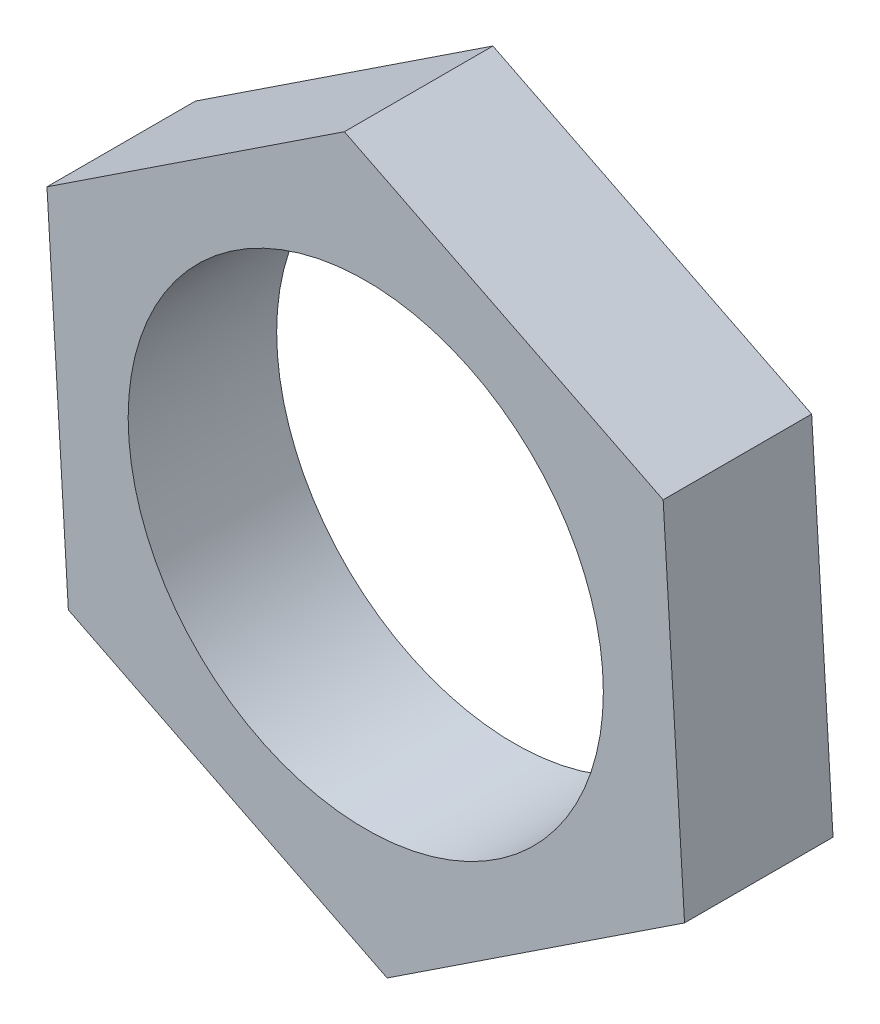
ISO-10303-21;
HEADER;
FILE_DESCRIPTION(('STEP AP214'),'2;1');
FILE_NAME('part.step','',(''),(''),'','','');
FILE_SCHEMA(('AUTOMOTIVE_DESIGN { 1 0 10303 214 1 1 1 1 }'));
ENDSEC;
DATA;
#1=APPLICATION_CONTEXT('core data for automotive mechanical design processes');
#2=APPLICATION_PROTOCOL_DEFINITION('international standard','automotive_design',2000,#1);
#3=PRODUCT_CONTEXT('',#1,'mechanical');
#4=PRODUCT('Part','Part','',(#3));
#5=PRODUCT_RELATED_PRODUCT_CATEGORY('part','',(#4));
#6=PRODUCT_DEFINITION_FORMATION('','',#4);
#7=PRODUCT_DEFINITION_CONTEXT('part definition',#1,'design');
#8=PRODUCT_DEFINITION('design','',#6,#7);
#9=PRODUCT_DEFINITION_SHAPE('','',#8);
#10=(LENGTH_UNIT() NAMED_UNIT(*) SI_UNIT(.MILLI.,.METRE.));
#11=(NAMED_UNIT(*) PLANE_ANGLE_UNIT() SI_UNIT($,.RADIAN.));
#12=(NAMED_UNIT(*) SI_UNIT($,.STERADIAN.) SOLID_ANGLE_UNIT());
#13=UNCERTAINTY_MEASURE_WITH_UNIT(LENGTH_MEASURE(1.E-05),#10,'distance_accuracy_value','');
#14=(GEOMETRIC_REPRESENTATION_CONTEXT(3) GLOBAL_UNCERTAINTY_ASSIGNED_CONTEXT((#13)) GLOBAL_UNIT_ASSIGNED_CONTEXT((#10,
#11,#12)) REPRESENTATION_CONTEXT('',''));
#15=CARTESIAN_POINT('',(0.,0.,0.));
#16=DIRECTION('',(0.,0.,1.));
#17=DIRECTION('',(1.,0.,0.));
#18=AXIS2_PLACEMENT_3D('',#15,#16,#17);
#19=CARTESIAN_POINT('',(0.,0.,5.));
#20=DIRECTION('',(0.,0.,1.));
#21=DIRECTION('',(1.,0.,0.));
#22=AXIS2_PLACEMENT_3D('',#19,#20,#21);
#23=PLANE('',#22);
#24=DIRECTION('',(-0.894448390647223,0.447171193692743,0.));
#25=VECTOR('',#24,1.);
#26=CARTESIAN_POINT('',(10.0138297068257,6.61235318193878,5.));
#27=LINE('',#26,#25);
#28=CARTESIAN_POINT('',(10.0138297068257,6.61235318193878,5.));
#29=VERTEX_POINT('',#28);
#30=CARTESIAN_POINT('',(-0.719550980941017,11.9784075062517,5.));
#31=VERTEX_POINT('',#30);
#32=EDGE_CURVE('E129',#29,#31,#27,.T.);
#33=ORIENTED_EDGE('',*,*,#32,.T.);
#34=DIRECTION('',(-0.834485808902139,-0.551029431828231,0.));
#35=VECTOR('',#34,1.);
#36=CARTESIAN_POINT('',(-0.719550980941017,11.9784075062517,5.));
#37=LINE('',#36,#35);
#38=CARTESIAN_POINT('',(-10.7333806877667,5.36605432431291,5.));
#39=VERTEX_POINT('',#38);
#40=EDGE_CURVE('E87',#31,#39,#37,.T.);
#41=ORIENTED_EDGE('',*,*,#40,.T.);
#42=DIRECTION('',(0.0599625817450846,-0.998200625520974,0.));
#43=VECTOR('',#42,1.);
#44=CARTESIAN_POINT('',(-10.7333806877667,5.36605432431291,5.));
#45=LINE('',#44,#43);
#46=CARTESIAN_POINT('',(-10.0138297068257,-6.61235318193877,5.));
#47=VERTEX_POINT('',#46);
#48=EDGE_CURVE('E100',#39,#47,#45,.T.);
#49=ORIENTED_EDGE('',*,*,#48,.T.);
#50=DIRECTION('',(0.894448390647223,-0.447171193692743,0.));
#51=VECTOR('',#50,1.);
#52=CARTESIAN_POINT('',(-10.0138297068257,-6.61235318193877,5.));
#53=LINE('',#52,#51);
#54=CARTESIAN_POINT('',(0.719550980941014,-11.9784075062517,5.));
#55=VERTEX_POINT('',#54);
#56=EDGE_CURVE('E94',#47,#55,#53,.T.);
#57=ORIENTED_EDGE('',*,*,#56,.T.);
#58=DIRECTION('',(0.834485808902139,0.551029431828231,0.));
#59=VECTOR('',#58,1.);
#60=CARTESIAN_POINT('',(0.719550980941014,-11.9784075062517,5.));
#61=LINE('',#60,#59);
#62=CARTESIAN_POINT('',(10.7333806877667,-5.36605432431291,5.));
#63=VERTEX_POINT('',#62);
#64=EDGE_CURVE('E98',#55,#63,#61,.T.);
#65=ORIENTED_EDGE('',*,*,#64,.T.);
#66=DIRECTION('',(-0.0599625817450843,0.998200625520974,0.));
#67=VECTOR('',#66,1.);
#68=CARTESIAN_POINT('',(10.7333806877667,-5.36605432431291,5.));
#69=LINE('',#68,#67);
#70=EDGE_CURVE('E50',#63,#29,#69,.T.);
#71=ORIENTED_EDGE('',*,*,#70,.T.);
#72=EDGE_LOOP('',(#33,#41,#49,#57,#65,#71));
#73=FACE_BOUND('',#72,.T.);
#74=CARTESIAN_POINT('',(0.,0.,5.));
#75=DIRECTION('',(0.,0.,1.));
#76=DIRECTION('',(1.,0.,0.));
#77=AXIS2_PLACEMENT_3D('',#74,#75,#76);
#78=CIRCLE('',#77,8.);
#79=CARTESIAN_POINT('',(8.,0.,5.));
#80=VERTEX_POINT('',#79);
#81=EDGE_CURVE('E122',#80,#80,#78,.T.);
#82=ORIENTED_EDGE('',*,*,#81,.F.);
#83=EDGE_LOOP('',(#82));
#84=FACE_BOUND('',#83,.T.);
#85=ADVANCED_FACE('F33',(#73,#84),#23,.T.);
#86=CARTESIAN_POINT('',(0.,0.,0.));
#87=DIRECTION('',(0.,0.,1.));
#88=DIRECTION('',(1.,0.,0.));
#89=AXIS2_PLACEMENT_3D('',#86,#87,#88);
#90=PLANE('',#89);
#91=DIRECTION('',(-0.894448390647223,0.447171193692743,0.));
#92=VECTOR('',#91,1.);
#93=CARTESIAN_POINT('',(10.0138297068257,6.61235318193878,0.));
#94=LINE('',#93,#92);
#95=CARTESIAN_POINT('',(10.0138297068257,6.61235318193878,0.));
#96=VERTEX_POINT('',#95);
#97=CARTESIAN_POINT('',(-0.719550980941017,11.9784075062517,0.));
#98=VERTEX_POINT('',#97);
#99=EDGE_CURVE('E118',#96,#98,#94,.T.);
#100=ORIENTED_EDGE('',*,*,#99,.F.);
#101=DIRECTION('',(-0.0599625817450843,0.998200625520974,0.));
#102=VECTOR('',#101,1.);
#103=CARTESIAN_POINT('',(10.7333806877667,-5.36605432431291,0.));
#104=LINE('',#103,#102);
#105=CARTESIAN_POINT('',(10.7333806877667,-5.36605432431291,0.));
#106=VERTEX_POINT('',#105);
#107=EDGE_CURVE('E79',#106,#96,#104,.T.);
#108=ORIENTED_EDGE('',*,*,#107,.F.);
#109=DIRECTION('',(0.834485808902139,0.551029431828231,0.));
#110=VECTOR('',#109,1.);
#111=CARTESIAN_POINT('',(0.719550980941014,-11.9784075062517,0.));
#112=LINE('',#111,#110);
#113=CARTESIAN_POINT('',(0.719550980941014,-11.9784075062517,0.));
#114=VERTEX_POINT('',#113);
#115=EDGE_CURVE('E73',#114,#106,#112,.T.);
#116=ORIENTED_EDGE('',*,*,#115,.F.);
#117=DIRECTION('',(0.894448390647223,-0.447171193692743,0.));
#118=VECTOR('',#117,1.);
#119=CARTESIAN_POINT('',(-10.0138297068257,-6.61235318193877,0.));
#120=LINE('',#119,#118);
#121=CARTESIAN_POINT('',(-10.0138297068257,-6.61235318193877,0.));
#122=VERTEX_POINT('',#121);
#123=EDGE_CURVE('E108',#122,#114,#120,.T.);
#124=ORIENTED_EDGE('',*,*,#123,.F.);
#125=DIRECTION('',(0.0599625817450846,-0.998200625520974,0.));
#126=VECTOR('',#125,1.);
#127=CARTESIAN_POINT('',(-10.7333806877667,5.36605432431291,0.));
#128=LINE('',#127,#126);
#129=CARTESIAN_POINT('',(-10.7333806877667,5.36605432431291,0.));
#130=VERTEX_POINT('',#129);
#131=EDGE_CURVE('E124',#130,#122,#128,.T.);
#132=ORIENTED_EDGE('',*,*,#131,.F.);
#133=DIRECTION('',(-0.834485808902139,-0.551029431828231,0.));
#134=VECTOR('',#133,1.);
#135=CARTESIAN_POINT('',(-0.719550980941017,11.9784075062517,0.));
#136=LINE('',#135,#134);
#137=EDGE_CURVE('E121',#98,#130,#136,.T.);
#138=ORIENTED_EDGE('',*,*,#137,.F.);
#139=EDGE_LOOP('',(#100,#108,#116,#124,#132,#138));
#140=FACE_BOUND('',#139,.T.);
#141=CARTESIAN_POINT('',(0.,0.,0.));
#142=DIRECTION('',(0.,0.,1.));
#143=DIRECTION('',(1.,0.,0.));
#144=AXIS2_PLACEMENT_3D('',#141,#142,#143);
#145=CIRCLE('',#144,8.);
#146=CARTESIAN_POINT('',(8.,0.,0.));
#147=VERTEX_POINT('',#146);
#148=EDGE_CURVE('E222',#147,#147,#145,.T.);
#149=ORIENTED_EDGE('',*,*,#148,.T.);
#150=EDGE_LOOP('',(#149));
#151=FACE_BOUND('',#150,.T.);
#152=ADVANCED_FACE('F138',(#140,#151),#90,.F.);
#153=CARTESIAN_POINT('',(10.0138297068257,6.61235318193878,5.));
#154=DIRECTION('',(-0.447171193692743,-0.894448390647223,0.));
#155=DIRECTION('',(0.894448390647223,-0.447171193692743,0.));
#156=AXIS2_PLACEMENT_3D('',#153,#154,#155);
#157=PLANE('',#156);
#158=ORIENTED_EDGE('',*,*,#99,.T.);
#159=DIRECTION('',(0.,0.,-1.));
#160=VECTOR('',#159,1.);
#161=CARTESIAN_POINT('',(-0.719550980941017,11.9784075062517,5.));
#162=LINE('',#161,#160);
#163=EDGE_CURVE('E11',#31,#98,#162,.T.);
#164=ORIENTED_EDGE('',*,*,#163,.F.);
#165=ORIENTED_EDGE('',*,*,#32,.F.);
#166=DIRECTION('',(0.,0.,-1.));
#167=VECTOR('',#166,1.);
#168=CARTESIAN_POINT('',(10.0138297068257,6.61235318193878,5.));
#169=LINE('',#168,#167);
#170=EDGE_CURVE('E114',#29,#96,#169,.T.);
#171=ORIENTED_EDGE('',*,*,#170,.T.);
#172=EDGE_LOOP('',(#158,#164,#165,#171));
#173=FACE_BOUND('',#172,.T.);
#174=ADVANCED_FACE('F35',(#173),#157,.F.);
#175=CARTESIAN_POINT('',(-0.719550980941017,11.9784075062517,5.));
#176=DIRECTION('',(0.551029431828231,-0.834485808902139,0.));
#177=DIRECTION('',(0.834485808902139,0.551029431828231,0.));
#178=AXIS2_PLACEMENT_3D('',#175,#176,#177);
#179=PLANE('',#178);
#180=ORIENTED_EDGE('',*,*,#137,.T.);
#181=DIRECTION('',(0.,0.,-1.));
#182=VECTOR('',#181,1.);
#183=CARTESIAN_POINT('',(-10.7333806877667,5.36605432431291,5.));
#184=LINE('',#183,#182);
#185=EDGE_CURVE('E42',#39,#130,#184,.T.);
#186=ORIENTED_EDGE('',*,*,#185,.F.);
#187=ORIENTED_EDGE('',*,*,#40,.F.);
#188=ORIENTED_EDGE('',*,*,#163,.T.);
#189=EDGE_LOOP('',(#180,#186,#187,#188));
#190=FACE_BOUND('',#189,.T.);
#191=ADVANCED_FACE('F163',(#190),#179,.F.);
#192=CARTESIAN_POINT('',(-10.7333806877667,5.36605432431291,5.));
#193=DIRECTION('',(0.998200625520974,0.0599625817450846,0.));
#194=DIRECTION('',(-0.0599625817450846,0.998200625520974,0.));
#195=AXIS2_PLACEMENT_3D('',#192,#193,#194);
#196=PLANE('',#195);
#197=ORIENTED_EDGE('',*,*,#131,.T.);
#198=DIRECTION('',(0.,0.,-1.));
#199=VECTOR('',#198,1.);
#200=CARTESIAN_POINT('',(-10.0138297068257,-6.61235318193877,5.));
#201=LINE('',#200,#199);
#202=EDGE_CURVE('E109',#47,#122,#201,.T.);
#203=ORIENTED_EDGE('',*,*,#202,.F.);
#204=ORIENTED_EDGE('',*,*,#48,.F.);
#205=ORIENTED_EDGE('',*,*,#185,.T.);
#206=EDGE_LOOP('',(#197,#203,#204,#205));
#207=FACE_BOUND('',#206,.T.);
#208=ADVANCED_FACE('F135',(#207),#196,.F.);
#209=CARTESIAN_POINT('',(-10.0138297068257,-6.61235318193877,5.));
#210=DIRECTION('',(0.447171193692743,0.894448390647223,0.));
#211=DIRECTION('',(-0.894448390647223,0.447171193692743,0.));
#212=AXIS2_PLACEMENT_3D('',#209,#210,#211);
#213=PLANE('',#212);
#214=ORIENTED_EDGE('',*,*,#123,.T.);
#215=DIRECTION('',(0.,0.,-1.));
#216=VECTOR('',#215,1.);
#217=CARTESIAN_POINT('',(0.719550980941014,-11.9784075062517,5.));
#218=LINE('',#217,#216);
#219=EDGE_CURVE('E105',#55,#114,#218,.T.);
#220=ORIENTED_EDGE('',*,*,#219,.F.);
#221=ORIENTED_EDGE('',*,*,#56,.F.);
#222=ORIENTED_EDGE('',*,*,#202,.T.);
#223=EDGE_LOOP('',(#214,#220,#221,#222));
#224=FACE_BOUND('',#223,.T.);
#225=ADVANCED_FACE('F106',(#224),#213,.F.);
#226=CARTESIAN_POINT('',(0.719550980941014,-11.9784075062517,5.));
#227=DIRECTION('',(-0.551029431828231,0.834485808902139,0.));
#228=DIRECTION('',(-0.834485808902139,-0.551029431828231,0.));
#229=AXIS2_PLACEMENT_3D('',#226,#227,#228);
#230=PLANE('',#229);
#231=ORIENTED_EDGE('',*,*,#115,.T.);
#232=DIRECTION('',(0.,0.,-1.));
#233=VECTOR('',#232,1.);
#234=CARTESIAN_POINT('',(10.7333806877667,-5.36605432431291,5.));
#235=LINE('',#234,#233);
#236=EDGE_CURVE('E110',#63,#106,#235,.T.);
#237=ORIENTED_EDGE('',*,*,#236,.F.);
#238=ORIENTED_EDGE('',*,*,#64,.F.);
#239=ORIENTED_EDGE('',*,*,#219,.T.);
#240=EDGE_LOOP('',(#231,#237,#238,#239));
#241=FACE_BOUND('',#240,.T.);
#242=ADVANCED_FACE('F112',(#241),#230,.F.);
#243=CARTESIAN_POINT('',(10.7333806877667,-5.36605432431291,5.));
#244=DIRECTION('',(-0.998200625520974,-0.0599625817450843,0.));
#245=DIRECTION('',(0.0599625817450843,-0.998200625520974,0.));
#246=AXIS2_PLACEMENT_3D('',#243,#244,#245);
#247=PLANE('',#246);
#248=ORIENTED_EDGE('',*,*,#107,.T.);
#249=ORIENTED_EDGE('',*,*,#170,.F.);
#250=ORIENTED_EDGE('',*,*,#70,.F.);
#251=ORIENTED_EDGE('',*,*,#236,.T.);
#252=EDGE_LOOP('',(#248,#249,#250,#251));
#253=FACE_BOUND('',#252,.T.);
#254=ADVANCED_FACE('F143',(#253),#247,.F.);
#255=CARTESIAN_POINT('',(0.,0.,5.));
#256=DIRECTION('',(0.,0.,-1.));
#257=DIRECTION('',(-1.,0.,0.));
#258=AXIS2_PLACEMENT_3D('',#255,#256,#257);
#259=CYLINDRICAL_SURFACE('',#258,8.);
#260=ORIENTED_EDGE('',*,*,#81,.T.);
#261=EDGE_LOOP('',(#260));
#262=FACE_BOUND('',#261,.T.);
#263=ORIENTED_EDGE('',*,*,#148,.F.);
#264=EDGE_LOOP('',(#263));
#265=FACE_BOUND('',#264,.T.);
#266=ADVANCED_FACE('F145',(#262,#265),#259,.F.);
#267=CLOSED_SHELL('',(#85,#152,#174,#191,#208,#225,#242,#254,#266));
#268=MANIFOLD_SOLID_BREP('B2',#267);
#269=ADVANCED_BREP_SHAPE_REPRESENTATION('',(#18,#268),#14);
#270=SHAPE_DEFINITION_REPRESENTATION(#9,#269);
ENDSEC;
END-ISO-10303-21;
